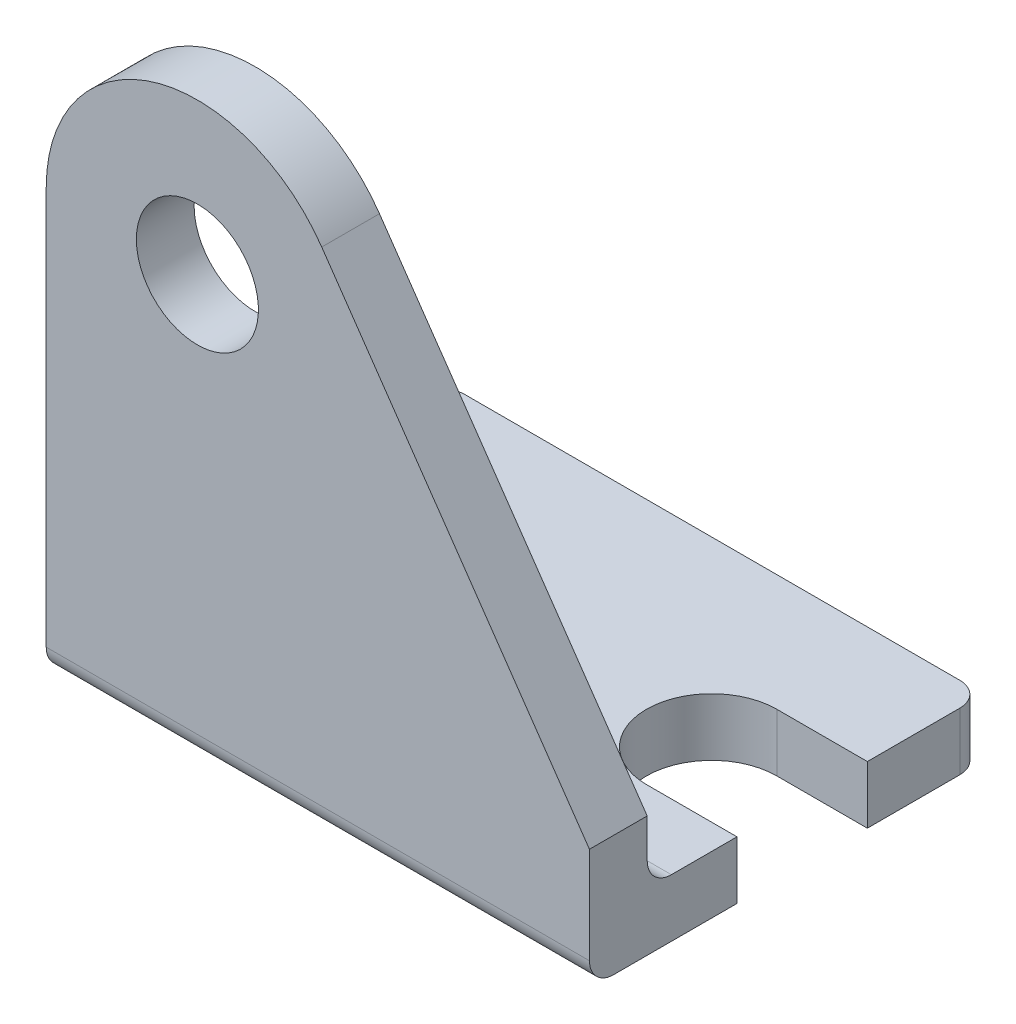
ISO-10303-21;
HEADER;
FILE_DESCRIPTION(('STEP AP214'),'2;1');
FILE_NAME('part.step','',(''),(''),'','','');
FILE_SCHEMA(('AUTOMOTIVE_DESIGN { 1 0 10303 214 1 1 1 1 }'));
ENDSEC;
DATA;
#1=APPLICATION_CONTEXT('core data for automotive mechanical design processes');
#2=APPLICATION_PROTOCOL_DEFINITION('international standard','automotive_design',2000,#1);
#3=PRODUCT_CONTEXT('',#1,'mechanical');
#4=PRODUCT('Part','Part','',(#3));
#5=PRODUCT_RELATED_PRODUCT_CATEGORY('part','',(#4));
#6=PRODUCT_DEFINITION_FORMATION('','',#4);
#7=PRODUCT_DEFINITION_CONTEXT('part definition',#1,'design');
#8=PRODUCT_DEFINITION('design','',#6,#7);
#9=PRODUCT_DEFINITION_SHAPE('','',#8);
#10=(LENGTH_UNIT() NAMED_UNIT(*) SI_UNIT(.MILLI.,.METRE.));
#11=(NAMED_UNIT(*) PLANE_ANGLE_UNIT() SI_UNIT($,.RADIAN.));
#12=(NAMED_UNIT(*) SI_UNIT($,.STERADIAN.) SOLID_ANGLE_UNIT());
#13=UNCERTAINTY_MEASURE_WITH_UNIT(LENGTH_MEASURE(1.E-05),#10,'distance_accuracy_value','');
#14=(GEOMETRIC_REPRESENTATION_CONTEXT(3) GLOBAL_UNCERTAINTY_ASSIGNED_CONTEXT((#13)) GLOBAL_UNIT_ASSIGNED_CONTEXT((#10,
#11,#12)) REPRESENTATION_CONTEXT('',''));
#15=CARTESIAN_POINT('',(0.,0.,0.));
#16=DIRECTION('',(0.,0.,1.));
#17=DIRECTION('',(1.,0.,0.));
#18=AXIS2_PLACEMENT_3D('',#15,#16,#17);
#19=CARTESIAN_POINT('',(4.7625,3.03784,-14.6177));
#20=DIRECTION('',(0.,0.,1.));
#21=DIRECTION('',(1.,0.,0.));
#22=AXIS2_PLACEMENT_3D('',#19,#20,#21);
#23=PLANE('',#22);
#24=DIRECTION('',(1.,0.,0.));
#25=VECTOR('',#24,1.);
#26=CARTESIAN_POINT('',(28.575,3.03784,-14.6177));
#27=LINE('',#26,#25);
#28=CARTESIAN_POINT('',(4.7625,3.03784,-14.6177));
#29=VERTEX_POINT('',#28);
#30=CARTESIAN_POINT('',(0.,3.03784,-14.6177));
#31=VERTEX_POINT('',#30);
#32=EDGE_CURVE('E248',#29,#31,#27,.F.);
#33=ORIENTED_EDGE('',*,*,#32,.T.);
#34=DIRECTION('',(0.,1.,0.));
#35=VECTOR('',#34,1.);
#36=CARTESIAN_POINT('',(0.,1.27000000000001,-14.6177));
#37=LINE('',#36,#35);
#38=CARTESIAN_POINT('',(0.,0.,-14.6177));
#39=VERTEX_POINT('',#38);
#40=EDGE_CURVE('E183',#31,#39,#37,.F.);
#41=ORIENTED_EDGE('',*,*,#40,.T.);
#42=DIRECTION('',(1.,0.,0.));
#43=VECTOR('',#42,1.);
#44=CARTESIAN_POINT('',(28.575,0.,-14.6177));
#45=LINE('',#44,#43);
#46=CARTESIAN_POINT('',(4.7625,0.,-14.6177));
#47=VERTEX_POINT('',#46);
#48=EDGE_CURVE('E240',#39,#47,#45,.T.);
#49=ORIENTED_EDGE('',*,*,#48,.T.);
#50=DIRECTION('',(0.,1.,0.));
#51=VECTOR('',#50,1.);
#52=CARTESIAN_POINT('',(4.7625,3.03784,-14.6177));
#53=LINE('',#52,#51);
#54=EDGE_CURVE('E182',#47,#29,#53,.T.);
#55=ORIENTED_EDGE('',*,*,#54,.T.);
#56=EDGE_LOOP('',(#33,#41,#49,#55));
#57=FACE_BOUND('',#56,.T.);
#58=ADVANCED_FACE('F17',(#57),#23,.T.);
#59=CARTESIAN_POINT('',(23.8125,3.03784,-11.1887));
#60=DIRECTION('',(0.,1.,0.));
#61=DIRECTION('',(0.,0.,1.));
#62=AXIS2_PLACEMENT_3D('',#59,#60,#61);
#63=CYLINDRICAL_SURFACE('',#62,3.429);
#64=DIRECTION('',(0.,1.,0.));
#65=VECTOR('',#64,1.);
#66=CARTESIAN_POINT('',(23.8125,3.03784,-14.6177));
#67=LINE('',#66,#65);
#68=CARTESIAN_POINT('',(23.8125,3.03784,-14.6177));
#69=VERTEX_POINT('',#68);
#70=CARTESIAN_POINT('',(23.8125,0.,-14.6177));
#71=VERTEX_POINT('',#70);
#72=EDGE_CURVE('E145',#69,#71,#67,.F.);
#73=ORIENTED_EDGE('',*,*,#72,.F.);
#74=CARTESIAN_POINT('',(23.8125,3.03784,-11.1887));
#75=DIRECTION('',(0.,1.,0.));
#76=DIRECTION('',(0.,0.,1.));
#77=AXIS2_PLACEMENT_3D('',#74,#75,#76);
#78=CIRCLE('',#77,3.429);
#79=CARTESIAN_POINT('',(23.8125,3.03784,-7.7597));
#80=VERTEX_POINT('',#79);
#81=EDGE_CURVE('E153',#69,#80,#78,.T.);
#82=ORIENTED_EDGE('',*,*,#81,.T.);
#83=DIRECTION('',(0.,1.,0.));
#84=VECTOR('',#83,1.);
#85=CARTESIAN_POINT('',(23.8125,3.03784,-7.7597));
#86=LINE('',#85,#84);
#87=CARTESIAN_POINT('',(23.8125,0.,-7.7597));
#88=VERTEX_POINT('',#87);
#89=EDGE_CURVE('E157',#88,#80,#86,.T.);
#90=ORIENTED_EDGE('',*,*,#89,.F.);
#91=CARTESIAN_POINT('',(23.8125,0.,-11.1887));
#92=DIRECTION('',(0.,1.,0.));
#93=DIRECTION('',(0.,0.,1.));
#94=AXIS2_PLACEMENT_3D('',#91,#92,#93);
#95=CIRCLE('',#94,3.429);
#96=EDGE_CURVE('E234',#88,#71,#95,.F.);
#97=ORIENTED_EDGE('',*,*,#96,.T.);
#98=EDGE_LOOP('',(#73,#82,#90,#97));
#99=FACE_BOUND('',#98,.T.);
#100=ADVANCED_FACE('F436',(#99),#63,.F.);
#101=CARTESIAN_POINT('',(28.575,3.03784,-14.6177));
#102=DIRECTION('',(0.,0.,1.));
#103=DIRECTION('',(1.,0.,0.));
#104=AXIS2_PLACEMENT_3D('',#101,#102,#103);
#105=PLANE('',#104);
#106=DIRECTION('',(1.,0.,0.));
#107=VECTOR('',#106,1.);
#108=CARTESIAN_POINT('',(28.575,3.03784,-14.6177));
#109=LINE('',#108,#107);
#110=CARTESIAN_POINT('',(28.575,3.03784,-14.6177));
#111=VERTEX_POINT('',#110);
#112=EDGE_CURVE('E141',#111,#69,#109,.F.);
#113=ORIENTED_EDGE('',*,*,#112,.T.);
#114=ORIENTED_EDGE('',*,*,#72,.T.);
#115=DIRECTION('',(1.,0.,0.));
#116=VECTOR('',#115,1.);
#117=CARTESIAN_POINT('',(28.575,0.,-14.6177));
#118=LINE('',#117,#116);
#119=CARTESIAN_POINT('',(28.575,0.,-14.6177));
#120=VERTEX_POINT('',#119);
#121=EDGE_CURVE('E143',#71,#120,#118,.T.);
#122=ORIENTED_EDGE('',*,*,#121,.T.);
#123=DIRECTION('',(0.,1.,0.));
#124=VECTOR('',#123,1.);
#125=CARTESIAN_POINT('',(28.575,1.27000000000001,-14.6177));
#126=LINE('',#125,#124);
#127=EDGE_CURVE('E138',#111,#120,#126,.F.);
#128=ORIENTED_EDGE('',*,*,#127,.F.);
#129=EDGE_LOOP('',(#113,#114,#122,#128));
#130=FACE_BOUND('',#129,.T.);
#131=ADVANCED_FACE('F140',(#130),#105,.T.);
#132=CARTESIAN_POINT('',(28.575,1.27000000000001,-1.27));
#133=DIRECTION('',(1.,0.,0.));
#134=DIRECTION('',(0.,0.,-1.));
#135=AXIS2_PLACEMENT_3D('',#132,#133,#134);
#136=PLANE('',#135);
#137=DIRECTION('',(0.,0.,-1.));
#138=VECTOR('',#137,1.);
#139=CARTESIAN_POINT('',(28.575,3.03784,-20.7518));
#140=LINE('',#139,#138);
#141=CARTESIAN_POINT('',(28.575,3.03784,-19.4818));
#142=VERTEX_POINT('',#141);
#143=EDGE_CURVE('E150',#142,#111,#140,.F.);
#144=ORIENTED_EDGE('',*,*,#143,.T.);
#145=ORIENTED_EDGE('',*,*,#127,.T.);
#146=DIRECTION('',(0.,0.,1.));
#147=VECTOR('',#146,1.);
#148=CARTESIAN_POINT('',(28.575,0.,-1.27));
#149=LINE('',#148,#147);
#150=CARTESIAN_POINT('',(28.575,0.,-19.4818));
#151=VERTEX_POINT('',#150);
#152=EDGE_CURVE('E233',#120,#151,#149,.F.);
#153=ORIENTED_EDGE('',*,*,#152,.T.);
#154=DIRECTION('',(0.,1.,0.));
#155=VECTOR('',#154,1.);
#156=CARTESIAN_POINT('',(28.575,3.03784,-19.4818));
#157=LINE('',#156,#155);
#158=EDGE_CURVE('E132',#142,#151,#157,.F.);
#159=ORIENTED_EDGE('',*,*,#158,.F.);
#160=EDGE_LOOP('',(#144,#145,#153,#159));
#161=FACE_BOUND('',#160,.T.);
#162=ADVANCED_FACE('F155',(#161),#136,.T.);
#163=CARTESIAN_POINT('',(27.305,3.03784,-19.4818));
#164=DIRECTION('',(0.,1.,0.));
#165=DIRECTION('',(0.,0.,1.));
#166=AXIS2_PLACEMENT_3D('',#163,#164,#165);
#167=CYLINDRICAL_SURFACE('',#166,1.27000000000001);
#168=CARTESIAN_POINT('',(27.305,3.03784,-19.4818));
#169=DIRECTION('',(0.,1.,0.));
#170=DIRECTION('',(0.,0.,1.));
#171=AXIS2_PLACEMENT_3D('',#168,#169,#170);
#172=CIRCLE('',#171,1.27000000000001);
#173=CARTESIAN_POINT('',(27.305,3.03784,-20.7518));
#174=VERTEX_POINT('',#173);
#175=EDGE_CURVE('E20',#174,#142,#172,.F.);
#176=ORIENTED_EDGE('',*,*,#175,.T.);
#177=ORIENTED_EDGE('',*,*,#158,.T.);
#178=CARTESIAN_POINT('',(27.305,0.,-19.4818));
#179=DIRECTION('',(0.,1.,0.));
#180=DIRECTION('',(0.,0.,1.));
#181=AXIS2_PLACEMENT_3D('',#178,#179,#180);
#182=CIRCLE('',#181,1.27000000000001);
#183=CARTESIAN_POINT('',(27.305,0.,-20.7518));
#184=VERTEX_POINT('',#183);
#185=EDGE_CURVE('E230',#151,#184,#182,.T.);
#186=ORIENTED_EDGE('',*,*,#185,.T.);
#187=DIRECTION('',(0.,1.,0.));
#188=VECTOR('',#187,1.);
#189=CARTESIAN_POINT('',(27.305,0.,-20.7518));
#190=LINE('',#189,#188);
#191=EDGE_CURVE('E190',#184,#174,#190,.T.);
#192=ORIENTED_EDGE('',*,*,#191,.T.);
#193=EDGE_LOOP('',(#176,#177,#186,#192));
#194=FACE_BOUND('',#193,.T.);
#195=ADVANCED_FACE('F428',(#194),#167,.T.);
#196=CARTESIAN_POINT('',(28.575,0.,-20.7518));
#197=DIRECTION('',(0.,0.,1.));
#198=DIRECTION('',(1.,0.,0.));
#199=AXIS2_PLACEMENT_3D('',#196,#197,#198);
#200=PLANE('',#199);
#201=DIRECTION('',(0.,1.,0.));
#202=VECTOR('',#201,1.);
#203=CARTESIAN_POINT('',(1.27,3.03784,-20.7518));
#204=LINE('',#203,#202);
#205=CARTESIAN_POINT('',(1.27,3.03784,-20.7518));
#206=VERTEX_POINT('',#205);
#207=CARTESIAN_POINT('',(1.27,0.,-20.7518));
#208=VERTEX_POINT('',#207);
#209=EDGE_CURVE('E186',#206,#208,#204,.F.);
#210=ORIENTED_EDGE('',*,*,#209,.F.);
#211=DIRECTION('',(1.,0.,0.));
#212=VECTOR('',#211,1.);
#213=CARTESIAN_POINT('',(28.575,3.03784,-20.7518));
#214=LINE('',#213,#212);
#215=EDGE_CURVE('E244',#206,#174,#214,.T.);
#216=ORIENTED_EDGE('',*,*,#215,.T.);
#217=ORIENTED_EDGE('',*,*,#191,.F.);
#218=DIRECTION('',(1.,0.,0.));
#219=VECTOR('',#218,1.);
#220=CARTESIAN_POINT('',(28.575,0.,-20.7518));
#221=LINE('',#220,#219);
#222=EDGE_CURVE('E229',#184,#208,#221,.F.);
#223=ORIENTED_EDGE('',*,*,#222,.T.);
#224=EDGE_LOOP('',(#210,#216,#217,#223));
#225=FACE_BOUND('',#224,.T.);
#226=ADVANCED_FACE('F424',(#225),#200,.F.);
#227=CARTESIAN_POINT('',(1.27,3.03784,-19.4818));
#228=DIRECTION('',(0.,1.,0.));
#229=DIRECTION('',(0.,0.,1.));
#230=AXIS2_PLACEMENT_3D('',#227,#228,#229);
#231=CYLINDRICAL_SURFACE('',#230,1.27);
#232=CARTESIAN_POINT('',(1.27,3.03784,-19.4818));
#233=DIRECTION('',(0.,1.,0.));
#234=DIRECTION('',(0.,0.,1.));
#235=AXIS2_PLACEMENT_3D('',#232,#233,#234);
#236=CIRCLE('',#235,1.27);
#237=CARTESIAN_POINT('',(0.,3.03784,-19.4818));
#238=VERTEX_POINT('',#237);
#239=EDGE_CURVE('E241',#238,#206,#236,.F.);
#240=ORIENTED_EDGE('',*,*,#239,.T.);
#241=ORIENTED_EDGE('',*,*,#209,.T.);
#242=CARTESIAN_POINT('',(1.27,0.,-19.4818));
#243=DIRECTION('',(0.,1.,0.));
#244=DIRECTION('',(0.,0.,1.));
#245=AXIS2_PLACEMENT_3D('',#242,#243,#244);
#246=CIRCLE('',#245,1.27);
#247=CARTESIAN_POINT('',(0.,0.,-19.4818));
#248=VERTEX_POINT('',#247);
#249=EDGE_CURVE('E225',#208,#248,#246,.T.);
#250=ORIENTED_EDGE('',*,*,#249,.T.);
#251=DIRECTION('',(0.,1.,0.));
#252=VECTOR('',#251,1.);
#253=CARTESIAN_POINT('',(0.,1.27000000000001,-19.4818));
#254=LINE('',#253,#252);
#255=EDGE_CURVE('E180',#248,#238,#254,.T.);
#256=ORIENTED_EDGE('',*,*,#255,.T.);
#257=EDGE_LOOP('',(#240,#241,#250,#256));
#258=FACE_BOUND('',#257,.T.);
#259=ADVANCED_FACE('F420',(#258),#231,.T.);
#260=CARTESIAN_POINT('',(0.,1.27000000000001,-1.27));
#261=DIRECTION('',(1.,0.,0.));
#262=DIRECTION('',(0.,0.,-1.));
#263=AXIS2_PLACEMENT_3D('',#260,#261,#262);
#264=PLANE('',#263);
#265=DIRECTION('',(0.,0.,1.));
#266=VECTOR('',#265,1.);
#267=CARTESIAN_POINT('',(0.,0.,-1.27));
#268=LINE('',#267,#266);
#269=EDGE_CURVE('E228',#248,#39,#268,.T.);
#270=ORIENTED_EDGE('',*,*,#269,.T.);
#271=ORIENTED_EDGE('',*,*,#40,.F.);
#272=DIRECTION('',(0.,0.,-1.));
#273=VECTOR('',#272,1.);
#274=CARTESIAN_POINT('',(0.,3.03784,-20.7518));
#275=LINE('',#274,#273);
#276=EDGE_CURVE('E245',#31,#238,#275,.T.);
#277=ORIENTED_EDGE('',*,*,#276,.T.);
#278=ORIENTED_EDGE('',*,*,#255,.F.);
#279=EDGE_LOOP('',(#270,#271,#277,#278));
#280=FACE_BOUND('',#279,.T.);
#281=ADVANCED_FACE('F416',(#280),#264,.F.);
#282=CARTESIAN_POINT('',(4.7625,3.03784,-11.1887));
#283=DIRECTION('',(0.,1.,0.));
#284=DIRECTION('',(0.,0.,1.));
#285=AXIS2_PLACEMENT_3D('',#282,#283,#284);
#286=CYLINDRICAL_SURFACE('',#285,3.429);
#287=ORIENTED_EDGE('',*,*,#54,.F.);
#288=CARTESIAN_POINT('',(4.7625,0.,-11.1887));
#289=DIRECTION('',(0.,1.,0.));
#290=DIRECTION('',(0.,0.,1.));
#291=AXIS2_PLACEMENT_3D('',#288,#289,#290);
#292=CIRCLE('',#291,3.429);
#293=CARTESIAN_POINT('',(4.7625,0.,-7.7597));
#294=VERTEX_POINT('',#293);
#295=EDGE_CURVE('E238',#47,#294,#292,.F.);
#296=ORIENTED_EDGE('',*,*,#295,.T.);
#297=DIRECTION('',(0.,1.,0.));
#298=VECTOR('',#297,1.);
#299=CARTESIAN_POINT('',(4.7625,3.03784,-7.7597));
#300=LINE('',#299,#298);
#301=CARTESIAN_POINT('',(4.7625,3.03784,-7.7597));
#302=VERTEX_POINT('',#301);
#303=EDGE_CURVE('E166',#302,#294,#300,.F.);
#304=ORIENTED_EDGE('',*,*,#303,.F.);
#305=CARTESIAN_POINT('',(4.7625,3.03784,-11.1887));
#306=DIRECTION('',(0.,1.,0.));
#307=DIRECTION('',(0.,0.,1.));
#308=AXIS2_PLACEMENT_3D('',#305,#306,#307);
#309=CIRCLE('',#308,3.429);
#310=EDGE_CURVE('E246',#302,#29,#309,.T.);
#311=ORIENTED_EDGE('',*,*,#310,.T.);
#312=EDGE_LOOP('',(#287,#296,#304,#311));
#313=FACE_BOUND('',#312,.T.);
#314=ADVANCED_FACE('F413',(#313),#286,.F.);
#315=CARTESIAN_POINT('',(23.8125,3.03784,-7.7597));
#316=DIRECTION('',(0.,0.,-1.));
#317=DIRECTION('',(-1.,0.,0.));
#318=AXIS2_PLACEMENT_3D('',#315,#316,#317);
#319=PLANE('',#318);
#320=DIRECTION('',(1.,0.,0.));
#321=VECTOR('',#320,1.);
#322=CARTESIAN_POINT('',(28.575,3.03784,-7.7597));
#323=LINE('',#322,#321);
#324=CARTESIAN_POINT('',(28.575,3.03784,-7.7597));
#325=VERTEX_POINT('',#324);
#326=EDGE_CURVE('E249',#80,#325,#323,.T.);
#327=ORIENTED_EDGE('',*,*,#326,.T.);
#328=DIRECTION('',(0.,1.,0.));
#329=VECTOR('',#328,1.);
#330=CARTESIAN_POINT('',(28.575,1.27000000000001,-7.7597));
#331=LINE('',#330,#329);
#332=CARTESIAN_POINT('',(28.575,0.,-7.7597));
#333=VERTEX_POINT('',#332);
#334=EDGE_CURVE('E170',#333,#325,#331,.T.);
#335=ORIENTED_EDGE('',*,*,#334,.F.);
#336=DIRECTION('',(1.,0.,0.));
#337=VECTOR('',#336,1.);
#338=CARTESIAN_POINT('',(28.575,0.,-7.7597));
#339=LINE('',#338,#337);
#340=EDGE_CURVE('E237',#333,#88,#339,.F.);
#341=ORIENTED_EDGE('',*,*,#340,.T.);
#342=ORIENTED_EDGE('',*,*,#89,.T.);
#343=EDGE_LOOP('',(#327,#335,#341,#342));
#344=FACE_BOUND('',#343,.T.);
#345=ADVANCED_FACE('F410',(#344),#319,.T.);
#346=CARTESIAN_POINT('',(28.575,3.03784,-20.7518));
#347=DIRECTION('',(0.,-1.,0.));
#348=DIRECTION('',(0.,0.,-1.));
#349=AXIS2_PLACEMENT_3D('',#346,#347,#348);
#350=PLANE('',#349);
#351=ORIENTED_EDGE('',*,*,#239,.F.);
#352=ORIENTED_EDGE('',*,*,#276,.F.);
#353=ORIENTED_EDGE('',*,*,#32,.F.);
#354=ORIENTED_EDGE('',*,*,#310,.F.);
#355=DIRECTION('',(-1.,0.,0.));
#356=VECTOR('',#355,1.);
#357=CARTESIAN_POINT('',(0.,3.03784,-7.7597));
#358=LINE('',#357,#356);
#359=CARTESIAN_POINT('',(0.,3.03784,-7.7597));
#360=VERTEX_POINT('',#359);
#361=EDGE_CURVE('E163',#360,#302,#358,.F.);
#362=ORIENTED_EDGE('',*,*,#361,.F.);
#363=DIRECTION('',(0.,0.,-1.));
#364=VECTOR('',#363,1.);
#365=CARTESIAN_POINT('',(0.,3.03784,-1.27));
#366=LINE('',#365,#364);
#367=CARTESIAN_POINT('',(0.,3.03784,-4.30784));
#368=VERTEX_POINT('',#367);
#369=EDGE_CURVE('E214',#360,#368,#366,.F.);
#370=ORIENTED_EDGE('',*,*,#369,.T.);
#371=DIRECTION('',(1.,0.,0.));
#372=VECTOR('',#371,1.);
#373=CARTESIAN_POINT('',(28.575,3.03784,-4.30784));
#374=LINE('',#373,#372);
#375=CARTESIAN_POINT('',(28.575,3.03784,-4.30784));
#376=VERTEX_POINT('',#375);
#377=EDGE_CURVE('E269',#368,#376,#374,.T.);
#378=ORIENTED_EDGE('',*,*,#377,.T.);
#379=DIRECTION('',(0.,0.,-1.));
#380=VECTOR('',#379,1.);
#381=CARTESIAN_POINT('',(28.575,3.03784,-1.27));
#382=LINE('',#381,#380);
#383=EDGE_CURVE('E173',#325,#376,#382,.F.);
#384=ORIENTED_EDGE('',*,*,#383,.F.);
#385=ORIENTED_EDGE('',*,*,#326,.F.);
#386=ORIENTED_EDGE('',*,*,#81,.F.);
#387=ORIENTED_EDGE('',*,*,#112,.F.);
#388=ORIENTED_EDGE('',*,*,#143,.F.);
#389=ORIENTED_EDGE('',*,*,#175,.F.);
#390=ORIENTED_EDGE('',*,*,#215,.F.);
#391=EDGE_LOOP('',(#351,#352,#353,#354,#362,#370,#378,#384,#385,#386,#387,#388,#389,#390));
#392=FACE_BOUND('',#391,.T.);
#393=ADVANCED_FACE('F149',(#392),#350,.F.);
#394=CARTESIAN_POINT('',(28.575,4.30784,-4.30784));
#395=DIRECTION('',(1.,0.,0.));
#396=DIRECTION('',(0.,0.,-1.));
#397=AXIS2_PLACEMENT_3D('',#394,#395,#396);
#398=CYLINDRICAL_SURFACE('',#397,1.27);
#399=DIRECTION('',(1.,0.,0.));
#400=VECTOR('',#399,1.);
#401=CARTESIAN_POINT('',(28.575,4.30784,-3.03784));
#402=LINE('',#401,#400);
#403=CARTESIAN_POINT('',(0.,4.30784,-3.03784));
#404=VERTEX_POINT('',#403);
#405=CARTESIAN_POINT('',(28.575,4.30784,-3.03784));
#406=VERTEX_POINT('',#405);
#407=EDGE_CURVE('E179',#404,#406,#402,.T.);
#408=ORIENTED_EDGE('',*,*,#407,.T.);
#409=CARTESIAN_POINT('',(28.575,4.30784,-4.30784));
#410=DIRECTION('',(1.,0.,0.));
#411=DIRECTION('',(0.,0.,-1.));
#412=AXIS2_PLACEMENT_3D('',#409,#410,#411);
#413=CIRCLE('',#412,1.27);
#414=EDGE_CURVE('E218',#376,#406,#413,.F.);
#415=ORIENTED_EDGE('',*,*,#414,.F.);
#416=ORIENTED_EDGE('',*,*,#377,.F.);
#417=CARTESIAN_POINT('',(0.,4.30784,-4.30784));
#418=DIRECTION('',(1.,0.,0.));
#419=DIRECTION('',(0.,0.,-1.));
#420=AXIS2_PLACEMENT_3D('',#417,#418,#419);
#421=CIRCLE('',#420,1.27);
#422=EDGE_CURVE('E211',#368,#404,#421,.F.);
#423=ORIENTED_EDGE('',*,*,#422,.T.);
#424=EDGE_LOOP('',(#408,#415,#416,#423));
#425=FACE_BOUND('',#424,.T.);
#426=ADVANCED_FACE('F403',(#425),#398,.F.);
#427=CARTESIAN_POINT('',(28.575,0.,-1.27));
#428=DIRECTION('',(0.,1.,0.));
#429=DIRECTION('',(0.,0.,1.));
#430=AXIS2_PLACEMENT_3D('',#427,#428,#429);
#431=PLANE('',#430);
#432=ORIENTED_EDGE('',*,*,#249,.F.);
#433=ORIENTED_EDGE('',*,*,#222,.F.);
#434=ORIENTED_EDGE('',*,*,#185,.F.);
#435=ORIENTED_EDGE('',*,*,#152,.F.);
#436=ORIENTED_EDGE('',*,*,#121,.F.);
#437=ORIENTED_EDGE('',*,*,#96,.F.);
#438=ORIENTED_EDGE('',*,*,#340,.F.);
#439=DIRECTION('',(0.,0.,-1.));
#440=VECTOR('',#439,1.);
#441=CARTESIAN_POINT('',(28.575,0.,-1.27));
#442=LINE('',#441,#440);
#443=CARTESIAN_POINT('',(28.575,0.,-1.27));
#444=VERTEX_POINT('',#443);
#445=EDGE_CURVE('E174',#444,#333,#442,.T.);
#446=ORIENTED_EDGE('',*,*,#445,.F.);
#447=DIRECTION('',(1.,0.,0.));
#448=VECTOR('',#447,1.);
#449=CARTESIAN_POINT('',(28.575,0.,-1.27));
#450=LINE('',#449,#448);
#451=CARTESIAN_POINT('',(0.,0.,-1.27));
#452=VERTEX_POINT('',#451);
#453=EDGE_CURVE('E217',#452,#444,#450,.T.);
#454=ORIENTED_EDGE('',*,*,#453,.F.);
#455=DIRECTION('',(0.,0.,-1.));
#456=VECTOR('',#455,1.);
#457=CARTESIAN_POINT('',(0.,0.,-1.27));
#458=LINE('',#457,#456);
#459=CARTESIAN_POINT('',(0.,0.,-7.7597));
#460=VERTEX_POINT('',#459);
#461=EDGE_CURVE('E209',#452,#460,#458,.T.);
#462=ORIENTED_EDGE('',*,*,#461,.T.);
#463=DIRECTION('',(-1.,0.,0.));
#464=VECTOR('',#463,1.);
#465=CARTESIAN_POINT('',(0.,0.,-7.7597));
#466=LINE('',#465,#464);
#467=EDGE_CURVE('E167',#294,#460,#466,.T.);
#468=ORIENTED_EDGE('',*,*,#467,.F.);
#469=ORIENTED_EDGE('',*,*,#295,.F.);
#470=ORIENTED_EDGE('',*,*,#48,.F.);
#471=ORIENTED_EDGE('',*,*,#269,.F.);
#472=EDGE_LOOP('',(#432,#433,#434,#435,#436,#437,#438,#446,#454,#462,#468,#469,#470,#471));
#473=FACE_BOUND('',#472,.T.);
#474=ADVANCED_FACE('F399',(#473),#431,.F.);
#475=CARTESIAN_POINT('',(0.,3.03784,-7.7597));
#476=DIRECTION('',(0.,0.,-1.));
#477=DIRECTION('',(-1.,0.,0.));
#478=AXIS2_PLACEMENT_3D('',#475,#476,#477);
#479=PLANE('',#478);
#480=ORIENTED_EDGE('',*,*,#361,.T.);
#481=ORIENTED_EDGE('',*,*,#303,.T.);
#482=ORIENTED_EDGE('',*,*,#467,.T.);
#483=DIRECTION('',(0.,1.,0.));
#484=VECTOR('',#483,1.);
#485=CARTESIAN_POINT('',(0.,1.27000000000001,-7.7597));
#486=LINE('',#485,#484);
#487=EDGE_CURVE('E205',#460,#360,#486,.T.);
#488=ORIENTED_EDGE('',*,*,#487,.T.);
#489=EDGE_LOOP('',(#480,#481,#482,#488));
#490=FACE_BOUND('',#489,.T.);
#491=ADVANCED_FACE('F395',(#490),#479,.T.);
#492=CARTESIAN_POINT('',(28.575,4.30784,-3.03784));
#493=DIRECTION('',(0.,0.,1.));
#494=DIRECTION('',(1.,0.,0.));
#495=AXIS2_PLACEMENT_3D('',#492,#493,#494);
#496=PLANE('',#495);
#497=DIRECTION('',(-0.568252355270083,0.822854337492367,0.));
#498=VECTOR('',#497,1.);
#499=CARTESIAN_POINT('',(28.575,6.35,-3.03784));
#500=LINE('',#499,#498);
#501=CARTESIAN_POINT('',(28.575,6.35,-3.03784));
#502=VERTEX_POINT('',#501);
#503=CARTESIAN_POINT('',(14.4920565539318,26.7427198748683,-3.03784));
#504=VERTEX_POINT('',#503);
#505=EDGE_CURVE('E224',#502,#504,#500,.T.);
#506=ORIENTED_EDGE('',*,*,#505,.F.);
#507=DIRECTION('',(0.,1.,0.));
#508=VECTOR('',#507,1.);
#509=CARTESIAN_POINT('',(28.575,1.27000000000001,-3.03784));
#510=LINE('',#509,#508);
#511=EDGE_CURVE('E220',#406,#502,#510,.T.);
#512=ORIENTED_EDGE('',*,*,#511,.F.);
#513=ORIENTED_EDGE('',*,*,#407,.F.);
#514=DIRECTION('',(0.,1.,0.));
#515=VECTOR('',#514,1.);
#516=CARTESIAN_POINT('',(0.,1.27000000000001,-3.03784));
#517=LINE('',#516,#515);
#518=CARTESIAN_POINT('',(0.,22.225,-3.03784));
#519=VERTEX_POINT('',#518);
#520=EDGE_CURVE('E210',#404,#519,#517,.T.);
#521=ORIENTED_EDGE('',*,*,#520,.T.);
#522=CARTESIAN_POINT('',(7.9502,22.225,-3.03784));
#523=DIRECTION('',(0.,0.,-1.));
#524=DIRECTION('',(-1.,0.,0.));
#525=AXIS2_PLACEMENT_3D('',#522,#523,#524);
#526=CIRCLE('',#525,7.9502);
#527=EDGE_CURVE('E203',#504,#519,#526,.F.);
#528=ORIENTED_EDGE('',*,*,#527,.F.);
#529=EDGE_LOOP('',(#506,#512,#513,#521,#528));
#530=FACE_BOUND('',#529,.T.);
#531=CARTESIAN_POINT('',(7.9502,22.225,-3.03784));
#532=DIRECTION('',(0.,0.,-1.));
#533=DIRECTION('',(-1.,0.,0.));
#534=AXIS2_PLACEMENT_3D('',#531,#532,#533);
#535=CIRCLE('',#534,3.209925);
#536=CARTESIAN_POINT('',(4.740275,22.225,-3.03784));
#537=VERTEX_POINT('',#536);
#538=EDGE_CURVE('E221',#537,#537,#535,.F.);
#539=ORIENTED_EDGE('',*,*,#538,.T.);
#540=EDGE_LOOP('',(#539));
#541=FACE_BOUND('',#540,.T.);
#542=ADVANCED_FACE('F391',(#530,#541),#496,.F.);
#543=CARTESIAN_POINT('',(7.9502,22.225,-3.03784));
#544=DIRECTION('',(0.,0.,-1.));
#545=DIRECTION('',(-1.,0.,0.));
#546=AXIS2_PLACEMENT_3D('',#543,#544,#545);
#547=CYLINDRICAL_SURFACE('',#546,3.209925);
#548=CARTESIAN_POINT('',(7.9502,22.225,0.));
#549=DIRECTION('',(0.,0.,-1.));
#550=DIRECTION('',(-1.,0.,0.));
#551=AXIS2_PLACEMENT_3D('',#548,#549,#550);
#552=CIRCLE('',#551,3.209925);
#553=CARTESIAN_POINT('',(4.740275,22.225,0.));
#554=VERTEX_POINT('',#553);
#555=EDGE_CURVE('E198',#554,#554,#552,.F.);
#556=ORIENTED_EDGE('',*,*,#555,.T.);
#557=EDGE_LOOP('',(#556));
#558=FACE_BOUND('',#557,.T.);
#559=ORIENTED_EDGE('',*,*,#538,.F.);
#560=EDGE_LOOP('',(#559));
#561=FACE_BOUND('',#560,.T.);
#562=ADVANCED_FACE('F388',(#558,#561),#547,.F.);
#563=CARTESIAN_POINT('',(28.575,6.35,-20.7518));
#564=DIRECTION('',(0.822854337492367,0.568252355270083,0.));
#565=DIRECTION('',(-0.568252355270083,0.822854337492367,0.));
#566=AXIS2_PLACEMENT_3D('',#563,#564,#565);
#567=PLANE('',#566);
#568=DIRECTION('',(0.568252355270082,-0.822854337492369,0.));
#569=VECTOR('',#568,1.);
#570=CARTESIAN_POINT('',(14.4920565539318,26.7427198748683,0.));
#571=LINE('',#570,#569);
#572=CARTESIAN_POINT('',(14.4920565539318,26.7427198748683,0.));
#573=VERTEX_POINT('',#572);
#574=CARTESIAN_POINT('',(28.575,6.35,0.));
#575=VERTEX_POINT('',#574);
#576=EDGE_CURVE('E201',#573,#575,#571,.T.);
#577=ORIENTED_EDGE('',*,*,#576,.T.);
#578=DIRECTION('',(0.,0.,-1.));
#579=VECTOR('',#578,1.);
#580=CARTESIAN_POINT('',(28.575,6.35,-1.27));
#581=LINE('',#580,#579);
#582=EDGE_CURVE('E275',#502,#575,#581,.F.);
#583=ORIENTED_EDGE('',*,*,#582,.F.);
#584=ORIENTED_EDGE('',*,*,#505,.T.);
#585=DIRECTION('',(0.,0.,-1.));
#586=VECTOR('',#585,1.);
#587=CARTESIAN_POINT('',(14.4920565539318,26.7427198748683,-20.7518));
#588=LINE('',#587,#586);
#589=EDGE_CURVE('E202',#573,#504,#588,.T.);
#590=ORIENTED_EDGE('',*,*,#589,.F.);
#591=EDGE_LOOP('',(#577,#583,#584,#590));
#592=FACE_BOUND('',#591,.T.);
#593=ADVANCED_FACE('F368',(#592),#567,.T.);
#594=CARTESIAN_POINT('',(28.575,1.27000000000001,-1.27));
#595=DIRECTION('',(1.,0.,0.));
#596=DIRECTION('',(0.,0.,-1.));
#597=AXIS2_PLACEMENT_3D('',#594,#595,#596);
#598=PLANE('',#597);
#599=DIRECTION('',(0.,1.,0.));
#600=VECTOR('',#599,1.);
#601=CARTESIAN_POINT('',(28.575,30.226,0.));
#602=LINE('',#601,#600);
#603=CARTESIAN_POINT('',(28.575,1.27000000000001,0.));
#604=VERTEX_POINT('',#603);
#605=EDGE_CURVE('E324',#575,#604,#602,.F.);
#606=ORIENTED_EDGE('',*,*,#605,.T.);
#607=CARTESIAN_POINT('',(28.575,1.27000000000001,-1.27));
#608=DIRECTION('',(1.,0.,0.));
#609=DIRECTION('',(0.,0.,-1.));
#610=AXIS2_PLACEMENT_3D('',#607,#608,#609);
#611=CIRCLE('',#610,1.27);
#612=EDGE_CURVE('E215',#444,#604,#611,.F.);
#613=ORIENTED_EDGE('',*,*,#612,.F.);
#614=ORIENTED_EDGE('',*,*,#445,.T.);
#615=ORIENTED_EDGE('',*,*,#334,.T.);
#616=ORIENTED_EDGE('',*,*,#383,.T.);
#617=ORIENTED_EDGE('',*,*,#414,.T.);
#618=ORIENTED_EDGE('',*,*,#511,.T.);
#619=ORIENTED_EDGE('',*,*,#582,.T.);
#620=EDGE_LOOP('',(#606,#613,#614,#615,#616,#617,#618,#619));
#621=FACE_BOUND('',#620,.T.);
#622=ADVANCED_FACE('F363',(#621),#598,.T.);
#623=CARTESIAN_POINT('',(28.575,1.27000000000001,-1.27));
#624=DIRECTION('',(1.,0.,0.));
#625=DIRECTION('',(0.,0.,-1.));
#626=AXIS2_PLACEMENT_3D('',#623,#624,#625);
#627=CYLINDRICAL_SURFACE('',#626,1.27);
#628=ORIENTED_EDGE('',*,*,#612,.T.);
#629=DIRECTION('',(-1.,0.,0.));
#630=VECTOR('',#629,1.);
#631=CARTESIAN_POINT('',(28.575,1.27,0.));
#632=LINE('',#631,#630);
#633=CARTESIAN_POINT('',(0.,1.27000000000001,0.));
#634=VERTEX_POINT('',#633);
#635=EDGE_CURVE('E327',#604,#634,#632,.T.);
#636=ORIENTED_EDGE('',*,*,#635,.T.);
#637=CARTESIAN_POINT('',(0.,1.27000000000001,-1.27));
#638=DIRECTION('',(1.,0.,0.));
#639=DIRECTION('',(0.,0.,-1.));
#640=AXIS2_PLACEMENT_3D('',#637,#638,#639);
#641=CIRCLE('',#640,1.27);
#642=EDGE_CURVE('E206',#634,#452,#641,.T.);
#643=ORIENTED_EDGE('',*,*,#642,.T.);
#644=ORIENTED_EDGE('',*,*,#453,.T.);
#645=EDGE_LOOP('',(#628,#636,#643,#644));
#646=FACE_BOUND('',#645,.T.);
#647=ADVANCED_FACE('F359',(#646),#627,.T.);
#648=CARTESIAN_POINT('',(0.,1.27000000000001,-1.27));
#649=DIRECTION('',(1.,0.,0.));
#650=DIRECTION('',(0.,0.,-1.));
#651=AXIS2_PLACEMENT_3D('',#648,#649,#650);
#652=PLANE('',#651);
#653=ORIENTED_EDGE('',*,*,#461,.F.);
#654=ORIENTED_EDGE('',*,*,#642,.F.);
#655=DIRECTION('',(0.,1.,0.));
#656=VECTOR('',#655,1.);
#657=CARTESIAN_POINT('',(0.,30.226,0.));
#658=LINE('',#657,#656);
#659=CARTESIAN_POINT('',(0.,22.225,0.));
#660=VERTEX_POINT('',#659);
#661=EDGE_CURVE('E26',#634,#660,#658,.T.);
#662=ORIENTED_EDGE('',*,*,#661,.T.);
#663=DIRECTION('',(0.,0.,-1.));
#664=VECTOR('',#663,1.);
#665=CARTESIAN_POINT('',(0.,22.225,-20.7518));
#666=LINE('',#665,#664);
#667=EDGE_CURVE('E34',#519,#660,#666,.F.);
#668=ORIENTED_EDGE('',*,*,#667,.F.);
#669=ORIENTED_EDGE('',*,*,#520,.F.);
#670=ORIENTED_EDGE('',*,*,#422,.F.);
#671=ORIENTED_EDGE('',*,*,#369,.F.);
#672=ORIENTED_EDGE('',*,*,#487,.F.);
#673=EDGE_LOOP('',(#653,#654,#662,#668,#669,#670,#671,#672));
#674=FACE_BOUND('',#673,.T.);
#675=ADVANCED_FACE('F351',(#674),#652,.F.);
#676=CARTESIAN_POINT('',(7.9502,22.225,-20.7518));
#677=DIRECTION('',(0.,0.,-1.));
#678=DIRECTION('',(-1.,0.,0.));
#679=AXIS2_PLACEMENT_3D('',#676,#677,#678);
#680=CYLINDRICAL_SURFACE('',#679,7.9502);
#681=CARTESIAN_POINT('',(7.9502,22.225,0.));
#682=DIRECTION('',(0.,0.,-1.));
#683=DIRECTION('',(-1.,0.,0.));
#684=AXIS2_PLACEMENT_3D('',#681,#682,#683);
#685=CIRCLE('',#684,7.9502);
#686=EDGE_CURVE('E11',#660,#573,#685,.T.);
#687=ORIENTED_EDGE('',*,*,#686,.T.);
#688=ORIENTED_EDGE('',*,*,#589,.T.);
#689=ORIENTED_EDGE('',*,*,#527,.T.);
#690=ORIENTED_EDGE('',*,*,#667,.T.);
#691=EDGE_LOOP('',(#687,#688,#689,#690));
#692=FACE_BOUND('',#691,.T.);
#693=ADVANCED_FACE('F371',(#692),#680,.T.);
#694=CARTESIAN_POINT('',(28.575,30.226,0.));
#695=DIRECTION('',(0.,0.,-1.));
#696=DIRECTION('',(-1.,0.,0.));
#697=AXIS2_PLACEMENT_3D('',#694,#695,#696);
#698=PLANE('',#697);
#699=ORIENTED_EDGE('',*,*,#661,.F.);
#700=ORIENTED_EDGE('',*,*,#635,.F.);
#701=ORIENTED_EDGE('',*,*,#605,.F.);
#702=ORIENTED_EDGE('',*,*,#576,.F.);
#703=ORIENTED_EDGE('',*,*,#686,.F.);
#704=EDGE_LOOP('',(#699,#700,#701,#702,#703));
#705=FACE_BOUND('',#704,.T.);
#706=ORIENTED_EDGE('',*,*,#555,.F.);
#707=EDGE_LOOP('',(#706));
#708=FACE_BOUND('',#707,.T.);
#709=ADVANCED_FACE('F355',(#705,#708),#698,.F.);
#710=CLOSED_SHELL('',(#58,#100,#131,#162,#195,#226,#259,#281,#314,#345,#393,#426,#474,#491,#542,
#562,#593,#622,#647,#675,#693,#709));
#711=MANIFOLD_SOLID_BREP('B1',#710);
#712=ADVANCED_BREP_SHAPE_REPRESENTATION('',(#18,#711),#14);
#713=SHAPE_DEFINITION_REPRESENTATION(#9,#712);
ENDSEC;
END-ISO-10303-21;
